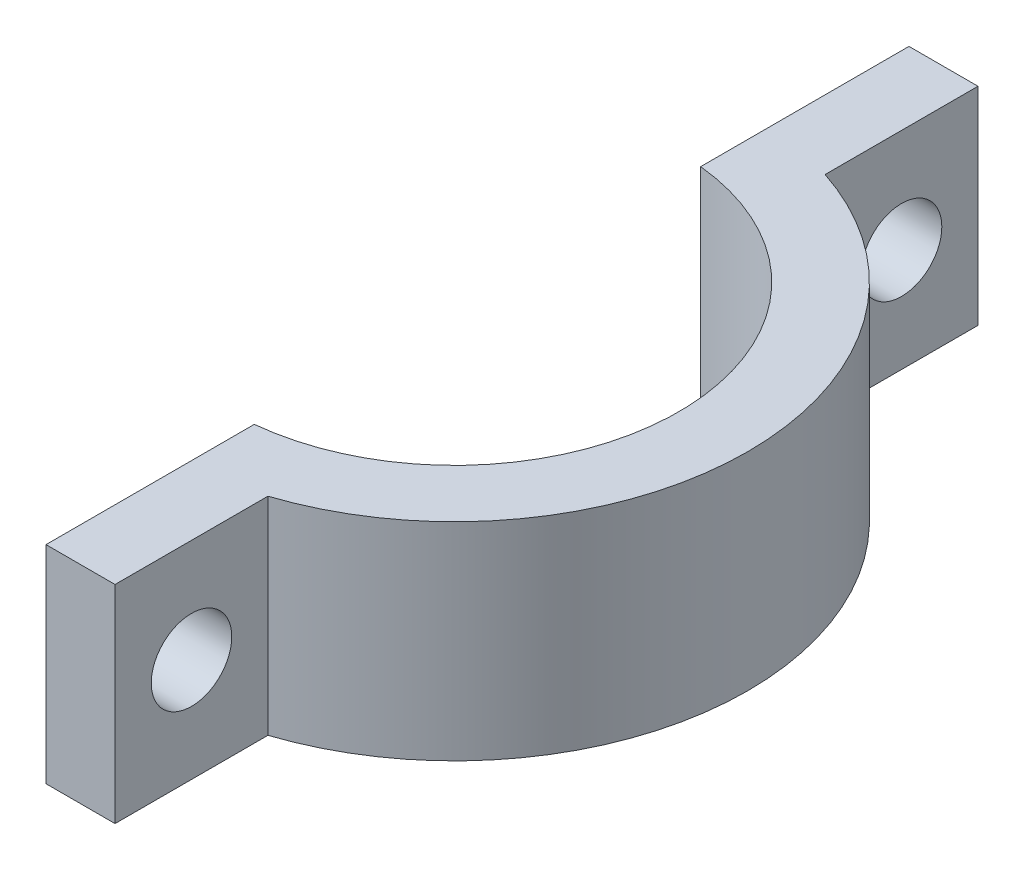
ISO-10303-21;
HEADER;
FILE_DESCRIPTION(('STEP AP214'),'2;1');
FILE_NAME('part.step','',(''),(''),'','','');
FILE_SCHEMA(('AUTOMOTIVE_DESIGN { 1 0 10303 214 1 1 1 1 }'));
ENDSEC;
DATA;
#1=APPLICATION_CONTEXT('core data for automotive mechanical design processes');
#2=APPLICATION_PROTOCOL_DEFINITION('international standard','automotive_design',2000,#1);
#3=PRODUCT_CONTEXT('',#1,'mechanical');
#4=PRODUCT('Part','Part','',(#3));
#5=PRODUCT_RELATED_PRODUCT_CATEGORY('part','',(#4));
#6=PRODUCT_DEFINITION_FORMATION('','',#4);
#7=PRODUCT_DEFINITION_CONTEXT('part definition',#1,'design');
#8=PRODUCT_DEFINITION('design','',#6,#7);
#9=PRODUCT_DEFINITION_SHAPE('','',#8);
#10=(LENGTH_UNIT() NAMED_UNIT(*) SI_UNIT(.MILLI.,.METRE.));
#11=(NAMED_UNIT(*) PLANE_ANGLE_UNIT() SI_UNIT($,.RADIAN.));
#12=(NAMED_UNIT(*) SI_UNIT($,.STERADIAN.) SOLID_ANGLE_UNIT());
#13=UNCERTAINTY_MEASURE_WITH_UNIT(LENGTH_MEASURE(1.E-05),#10,'distance_accuracy_value','');
#14=(GEOMETRIC_REPRESENTATION_CONTEXT(3) GLOBAL_UNCERTAINTY_ASSIGNED_CONTEXT((#13)) GLOBAL_UNIT_ASSIGNED_CONTEXT((#10,
#11,#12)) REPRESENTATION_CONTEXT('',''));
#15=CARTESIAN_POINT('',(0.,0.,0.));
#16=DIRECTION('',(0.,0.,1.));
#17=DIRECTION('',(1.,0.,0.));
#18=AXIS2_PLACEMENT_3D('',#15,#16,#17);
#19=CARTESIAN_POINT('',(4.,9.,-18.75));
#20=DIRECTION('',(0.,0.,1.));
#21=DIRECTION('',(1.,0.,0.));
#22=AXIS2_PLACEMENT_3D('',#19,#20,#21);
#23=PLANE('',#22);
#24=DIRECTION('',(-1.,0.,0.));
#25=VECTOR('',#24,1.);
#26=CARTESIAN_POINT('',(4.,0.,-18.75));
#27=LINE('',#26,#25);
#28=CARTESIAN_POINT('',(4.,0.,-18.75));
#29=VERTEX_POINT('',#28);
#30=CARTESIAN_POINT('',(1.,0.,-18.75));
#31=VERTEX_POINT('',#30);
#32=EDGE_CURVE('E128',#29,#31,#27,.T.);
#33=ORIENTED_EDGE('',*,*,#32,.T.);
#34=DIRECTION('',(0.,-1.,0.));
#35=VECTOR('',#34,1.);
#36=CARTESIAN_POINT('',(1.,9.,-18.75));
#37=LINE('',#36,#35);
#38=CARTESIAN_POINT('',(1.,9.,-18.75));
#39=VERTEX_POINT('',#38);
#40=EDGE_CURVE('E11',#39,#31,#37,.T.);
#41=ORIENTED_EDGE('',*,*,#40,.F.);
#42=DIRECTION('',(-1.,0.,0.));
#43=VECTOR('',#42,1.);
#44=CARTESIAN_POINT('',(4.,9.,-18.75));
#45=LINE('',#44,#43);
#46=CARTESIAN_POINT('',(4.,9.,-18.75));
#47=VERTEX_POINT('',#46);
#48=EDGE_CURVE('E143',#47,#39,#45,.T.);
#49=ORIENTED_EDGE('',*,*,#48,.F.);
#50=DIRECTION('',(0.,-1.,0.));
#51=VECTOR('',#50,1.);
#52=CARTESIAN_POINT('',(4.,9.,-18.75));
#53=LINE('',#52,#51);
#54=EDGE_CURVE('E124',#47,#29,#53,.T.);
#55=ORIENTED_EDGE('',*,*,#54,.T.);
#56=EDGE_LOOP('',(#33,#41,#49,#55));
#57=FACE_BOUND('',#56,.T.);
#58=ADVANCED_FACE('F32',(#57),#23,.F.);
#59=CARTESIAN_POINT('',(1.,9.,-18.75));
#60=DIRECTION('',(1.,0.,0.));
#61=DIRECTION('',(0.,0.,-1.));
#62=AXIS2_PLACEMENT_3D('',#59,#60,#61);
#63=PLANE('',#62);
#64=CARTESIAN_POINT('',(1.,4.5,-15.4281500064016));
#65=DIRECTION('',(1.,0.,0.));
#66=DIRECTION('',(0.,0.,-1.));
#67=AXIS2_PLACEMENT_3D('',#64,#65,#66);
#68=CIRCLE('',#67,1.75);
#69=CARTESIAN_POINT('',(1.,4.5,-17.1781500064016));
#70=VERTEX_POINT('',#69);
#71=EDGE_CURVE('E178',#70,#70,#68,.T.);
#72=ORIENTED_EDGE('',*,*,#71,.T.);
#73=EDGE_LOOP('',(#72));
#74=FACE_BOUND('',#73,.T.);
#75=DIRECTION('',(0.,0.,1.));
#76=VECTOR('',#75,1.);
#77=CARTESIAN_POINT('',(1.,0.,-18.75));
#78=LINE('',#77,#76);
#79=CARTESIAN_POINT('',(1.,0.,-9.69858237063541));
#80=VERTEX_POINT('',#79);
#81=EDGE_CURVE('E131',#31,#80,#78,.T.);
#82=ORIENTED_EDGE('',*,*,#81,.T.);
#83=DIRECTION('',(0.,-1.,0.));
#84=VECTOR('',#83,1.);
#85=CARTESIAN_POINT('',(1.,9.,-9.69858237063541));
#86=LINE('',#85,#84);
#87=CARTESIAN_POINT('',(1.,9.,-9.69858237063541));
#88=VERTEX_POINT('',#87);
#89=EDGE_CURVE('E40',#88,#80,#86,.T.);
#90=ORIENTED_EDGE('',*,*,#89,.F.);
#91=DIRECTION('',(0.,0.,1.));
#92=VECTOR('',#91,1.);
#93=CARTESIAN_POINT('',(1.,9.,-18.75));
#94=LINE('',#93,#92);
#95=EDGE_CURVE('E91',#39,#88,#94,.T.);
#96=ORIENTED_EDGE('',*,*,#95,.F.);
#97=ORIENTED_EDGE('',*,*,#40,.T.);
#98=EDGE_LOOP('',(#82,#90,#96,#97));
#99=FACE_BOUND('',#98,.T.);
#100=ADVANCED_FACE('F201',(#74,#99),#63,.F.);
#101=CARTESIAN_POINT('',(0.,9.,0.));
#102=DIRECTION('',(0.,-1.,0.));
#103=DIRECTION('',(0.,0.,-1.));
#104=AXIS2_PLACEMENT_3D('',#101,#102,#103);
#105=CYLINDRICAL_SURFACE('',#104,9.75);
#106=CARTESIAN_POINT('',(0.,0.,0.));
#107=DIRECTION('',(0.,-1.,0.));
#108=DIRECTION('',(0.,0.,1.));
#109=AXIS2_PLACEMENT_3D('',#106,#107,#108);
#110=CIRCLE('',#109,9.75);
#111=CARTESIAN_POINT('',(1.,0.,9.69858237063541));
#112=VERTEX_POINT('',#111);
#113=EDGE_CURVE('E134',#80,#112,#110,.T.);
#114=ORIENTED_EDGE('',*,*,#113,.T.);
#115=DIRECTION('',(0.,-1.,0.));
#116=VECTOR('',#115,1.);
#117=CARTESIAN_POINT('',(1.,9.,9.69858237063541));
#118=LINE('',#117,#116);
#119=CARTESIAN_POINT('',(1.,9.,9.69858237063541));
#120=VERTEX_POINT('',#119);
#121=EDGE_CURVE('E150',#120,#112,#118,.T.);
#122=ORIENTED_EDGE('',*,*,#121,.F.);
#123=CARTESIAN_POINT('',(0.,9.,0.));
#124=DIRECTION('',(0.,-1.,0.));
#125=DIRECTION('',(0.,0.,1.));
#126=AXIS2_PLACEMENT_3D('',#123,#124,#125);
#127=CIRCLE('',#126,9.75);
#128=EDGE_CURVE('E158',#88,#120,#127,.T.);
#129=ORIENTED_EDGE('',*,*,#128,.F.);
#130=ORIENTED_EDGE('',*,*,#89,.T.);
#131=EDGE_LOOP('',(#114,#122,#129,#130));
#132=FACE_BOUND('',#131,.T.);
#133=ADVANCED_FACE('F156',(#132),#105,.F.);
#134=CARTESIAN_POINT('',(1.,9.,18.75));
#135=DIRECTION('',(1.,0.,0.));
#136=DIRECTION('',(0.,0.,-1.));
#137=AXIS2_PLACEMENT_3D('',#134,#135,#136);
#138=PLANE('',#137);
#139=CARTESIAN_POINT('',(1.,4.5,15.4281500064016));
#140=DIRECTION('',(1.,0.,0.));
#141=DIRECTION('',(0.,0.,-1.));
#142=AXIS2_PLACEMENT_3D('',#139,#140,#141);
#143=CIRCLE('',#142,1.75);
#144=CARTESIAN_POINT('',(1.,4.5,13.6781500064016));
#145=VERTEX_POINT('',#144);
#146=EDGE_CURVE('E132',#145,#145,#143,.T.);
#147=ORIENTED_EDGE('',*,*,#146,.T.);
#148=EDGE_LOOP('',(#147));
#149=FACE_BOUND('',#148,.T.);
#150=DIRECTION('',(0.,0.,1.));
#151=VECTOR('',#150,1.);
#152=CARTESIAN_POINT('',(1.,0.,18.75));
#153=LINE('',#152,#151);
#154=CARTESIAN_POINT('',(1.,0.,18.75));
#155=VERTEX_POINT('',#154);
#156=EDGE_CURVE('E136',#112,#155,#153,.T.);
#157=ORIENTED_EDGE('',*,*,#156,.T.);
#158=DIRECTION('',(0.,-1.,0.));
#159=VECTOR('',#158,1.);
#160=CARTESIAN_POINT('',(1.,9.,18.75));
#161=LINE('',#160,#159);
#162=CARTESIAN_POINT('',(1.,9.,18.75));
#163=VERTEX_POINT('',#162);
#164=EDGE_CURVE('E147',#163,#155,#161,.T.);
#165=ORIENTED_EDGE('',*,*,#164,.F.);
#166=DIRECTION('',(0.,0.,1.));
#167=VECTOR('',#166,1.);
#168=CARTESIAN_POINT('',(1.,9.,18.75));
#169=LINE('',#168,#167);
#170=EDGE_CURVE('E170',#120,#163,#169,.T.);
#171=ORIENTED_EDGE('',*,*,#170,.F.);
#172=ORIENTED_EDGE('',*,*,#121,.T.);
#173=EDGE_LOOP('',(#157,#165,#171,#172));
#174=FACE_BOUND('',#173,.T.);
#175=ADVANCED_FACE('F166',(#149,#174),#138,.F.);
#176=CARTESIAN_POINT('',(4.,9.,18.75));
#177=DIRECTION('',(0.,0.,-1.));
#178=DIRECTION('',(-1.,0.,0.));
#179=AXIS2_PLACEMENT_3D('',#176,#177,#178);
#180=PLANE('',#179);
#181=DIRECTION('',(1.,0.,0.));
#182=VECTOR('',#181,1.);
#183=CARTESIAN_POINT('',(4.,0.,18.75));
#184=LINE('',#183,#182);
#185=CARTESIAN_POINT('',(4.,0.,18.75));
#186=VERTEX_POINT('',#185);
#187=EDGE_CURVE('E138',#155,#186,#184,.T.);
#188=ORIENTED_EDGE('',*,*,#187,.T.);
#189=DIRECTION('',(0.,-1.,0.));
#190=VECTOR('',#189,1.);
#191=CARTESIAN_POINT('',(4.,9.,18.75));
#192=LINE('',#191,#190);
#193=CARTESIAN_POINT('',(4.,9.,18.75));
#194=VERTEX_POINT('',#193);
#195=EDGE_CURVE('E119',#194,#186,#192,.T.);
#196=ORIENTED_EDGE('',*,*,#195,.F.);
#197=DIRECTION('',(1.,0.,0.));
#198=VECTOR('',#197,1.);
#199=CARTESIAN_POINT('',(4.,9.,18.75));
#200=LINE('',#199,#198);
#201=EDGE_CURVE('E110',#163,#194,#200,.T.);
#202=ORIENTED_EDGE('',*,*,#201,.F.);
#203=ORIENTED_EDGE('',*,*,#164,.T.);
#204=EDGE_LOOP('',(#188,#196,#202,#203));
#205=FACE_BOUND('',#204,.T.);
#206=ADVANCED_FACE('F169',(#205),#180,.F.);
#207=CARTESIAN_POINT('',(4.,9.,18.75));
#208=DIRECTION('',(-1.,0.,0.));
#209=DIRECTION('',(0.,0.,1.));
#210=AXIS2_PLACEMENT_3D('',#207,#208,#209);
#211=PLANE('',#210);
#212=CARTESIAN_POINT('',(4.,4.5,15.4281500064016));
#213=DIRECTION('',(1.,0.,0.));
#214=DIRECTION('',(0.,0.,-1.));
#215=AXIS2_PLACEMENT_3D('',#212,#213,#214);
#216=CIRCLE('',#215,1.75);
#217=CARTESIAN_POINT('',(4.,4.5,13.6781500064016));
#218=VERTEX_POINT('',#217);
#219=EDGE_CURVE('E181',#218,#218,#216,.T.);
#220=ORIENTED_EDGE('',*,*,#219,.F.);
#221=EDGE_LOOP('',(#220));
#222=FACE_BOUND('',#221,.T.);
#223=DIRECTION('',(0.,0.,-1.));
#224=VECTOR('',#223,1.);
#225=CARTESIAN_POINT('',(4.,0.,18.75));
#226=LINE('',#225,#224);
#227=CARTESIAN_POINT('',(4.,0.,12.1063000128033));
#228=VERTEX_POINT('',#227);
#229=EDGE_CURVE('E118',#186,#228,#226,.T.);
#230=ORIENTED_EDGE('',*,*,#229,.T.);
#231=DIRECTION('',(0.,-1.,0.));
#232=VECTOR('',#231,1.);
#233=CARTESIAN_POINT('',(4.,9.,12.1063000128033));
#234=LINE('',#233,#232);
#235=CARTESIAN_POINT('',(4.,9.,12.1063000128033));
#236=VERTEX_POINT('',#235);
#237=EDGE_CURVE('E115',#236,#228,#234,.T.);
#238=ORIENTED_EDGE('',*,*,#237,.F.);
#239=DIRECTION('',(0.,0.,-1.));
#240=VECTOR('',#239,1.);
#241=CARTESIAN_POINT('',(4.,9.,18.75));
#242=LINE('',#241,#240);
#243=EDGE_CURVE('E104',#194,#236,#242,.T.);
#244=ORIENTED_EDGE('',*,*,#243,.F.);
#245=ORIENTED_EDGE('',*,*,#195,.T.);
#246=EDGE_LOOP('',(#230,#238,#244,#245));
#247=FACE_BOUND('',#246,.T.);
#248=ADVANCED_FACE('F116',(#222,#247),#211,.F.);
#249=CARTESIAN_POINT('',(0.,9.,0.));
#250=DIRECTION('',(0.,-1.,0.));
#251=DIRECTION('',(0.,0.,-1.));
#252=AXIS2_PLACEMENT_3D('',#249,#250,#251);
#253=CYLINDRICAL_SURFACE('',#252,12.75);
#254=CARTESIAN_POINT('',(0.,0.,0.));
#255=DIRECTION('',(0.,1.,0.));
#256=DIRECTION('',(0.,0.,1.));
#257=AXIS2_PLACEMENT_3D('',#254,#255,#256);
#258=CIRCLE('',#257,12.75);
#259=CARTESIAN_POINT('',(4.,0.,-12.1063000128033));
#260=VERTEX_POINT('',#259);
#261=EDGE_CURVE('E77',#228,#260,#258,.T.);
#262=ORIENTED_EDGE('',*,*,#261,.T.);
#263=DIRECTION('',(0.,-1.,0.));
#264=VECTOR('',#263,1.);
#265=CARTESIAN_POINT('',(4.,9.,-12.1063000128033));
#266=LINE('',#265,#264);
#267=CARTESIAN_POINT('',(4.,9.,-12.1063000128033));
#268=VERTEX_POINT('',#267);
#269=EDGE_CURVE('E120',#268,#260,#266,.T.);
#270=ORIENTED_EDGE('',*,*,#269,.F.);
#271=CARTESIAN_POINT('',(0.,9.,0.));
#272=DIRECTION('',(0.,1.,0.));
#273=DIRECTION('',(0.,0.,1.));
#274=AXIS2_PLACEMENT_3D('',#271,#272,#273);
#275=CIRCLE('',#274,12.75);
#276=EDGE_CURVE('E108',#236,#268,#275,.T.);
#277=ORIENTED_EDGE('',*,*,#276,.F.);
#278=ORIENTED_EDGE('',*,*,#237,.T.);
#279=EDGE_LOOP('',(#262,#270,#277,#278));
#280=FACE_BOUND('',#279,.T.);
#281=ADVANCED_FACE('F122',(#280),#253,.T.);
#282=CARTESIAN_POINT('',(4.,9.,-18.75));
#283=DIRECTION('',(-1.,0.,0.));
#284=DIRECTION('',(0.,0.,1.));
#285=AXIS2_PLACEMENT_3D('',#282,#283,#284);
#286=PLANE('',#285);
#287=CARTESIAN_POINT('',(4.,4.5,-15.4281500064016));
#288=DIRECTION('',(1.,0.,0.));
#289=DIRECTION('',(0.,0.,-1.));
#290=AXIS2_PLACEMENT_3D('',#287,#288,#289);
#291=CIRCLE('',#290,1.75);
#292=CARTESIAN_POINT('',(4.,4.5,-17.1781500064016));
#293=VERTEX_POINT('',#292);
#294=EDGE_CURVE('E182',#293,#293,#291,.T.);
#295=ORIENTED_EDGE('',*,*,#294,.F.);
#296=EDGE_LOOP('',(#295));
#297=FACE_BOUND('',#296,.T.);
#298=DIRECTION('',(0.,0.,-1.));
#299=VECTOR('',#298,1.);
#300=CARTESIAN_POINT('',(4.,0.,-18.75));
#301=LINE('',#300,#299);
#302=EDGE_CURVE('E83',#260,#29,#301,.T.);
#303=ORIENTED_EDGE('',*,*,#302,.T.);
#304=ORIENTED_EDGE('',*,*,#54,.F.);
#305=DIRECTION('',(0.,0.,-1.));
#306=VECTOR('',#305,1.);
#307=CARTESIAN_POINT('',(4.,9.,-18.75));
#308=LINE('',#307,#306);
#309=EDGE_CURVE('E48',#268,#47,#308,.T.);
#310=ORIENTED_EDGE('',*,*,#309,.F.);
#311=ORIENTED_EDGE('',*,*,#269,.T.);
#312=EDGE_LOOP('',(#303,#304,#310,#311));
#313=FACE_BOUND('',#312,.T.);
#314=ADVANCED_FACE('F197',(#297,#313),#286,.F.);
#315=CARTESIAN_POINT('',(0.,9.,0.));
#316=DIRECTION('',(0.,1.,0.));
#317=DIRECTION('',(0.,0.,1.));
#318=AXIS2_PLACEMENT_3D('',#315,#316,#317);
#319=PLANE('',#318);
#320=ORIENTED_EDGE('',*,*,#48,.T.);
#321=ORIENTED_EDGE('',*,*,#95,.T.);
#322=ORIENTED_EDGE('',*,*,#128,.T.);
#323=ORIENTED_EDGE('',*,*,#170,.T.);
#324=ORIENTED_EDGE('',*,*,#201,.T.);
#325=ORIENTED_EDGE('',*,*,#243,.T.);
#326=ORIENTED_EDGE('',*,*,#276,.T.);
#327=ORIENTED_EDGE('',*,*,#309,.T.);
#328=EDGE_LOOP('',(#320,#321,#322,#323,#324,#325,#326,#327));
#329=FACE_BOUND('',#328,.T.);
#330=ADVANCED_FACE('F106',(#329),#319,.T.);
#331=CARTESIAN_POINT('',(0.,0.,0.));
#332=DIRECTION('',(0.,1.,0.));
#333=DIRECTION('',(0.,0.,1.));
#334=AXIS2_PLACEMENT_3D('',#331,#332,#333);
#335=PLANE('',#334);
#336=ORIENTED_EDGE('',*,*,#32,.F.);
#337=ORIENTED_EDGE('',*,*,#302,.F.);
#338=ORIENTED_EDGE('',*,*,#261,.F.);
#339=ORIENTED_EDGE('',*,*,#229,.F.);
#340=ORIENTED_EDGE('',*,*,#187,.F.);
#341=ORIENTED_EDGE('',*,*,#156,.F.);
#342=ORIENTED_EDGE('',*,*,#113,.F.);
#343=ORIENTED_EDGE('',*,*,#81,.F.);
#344=EDGE_LOOP('',(#336,#337,#338,#339,#340,#341,#342,#343));
#345=FACE_BOUND('',#344,.T.);
#346=ADVANCED_FACE('F162',(#345),#335,.F.);
#347=CARTESIAN_POINT('',(-6.,4.5,-15.4281500064016));
#348=DIRECTION('',(1.,0.,0.));
#349=DIRECTION('',(0.,0.,-1.));
#350=AXIS2_PLACEMENT_3D('',#347,#348,#349);
#351=CYLINDRICAL_SURFACE('',#350,1.75);
#352=ORIENTED_EDGE('',*,*,#294,.T.);
#353=EDGE_LOOP('',(#352));
#354=FACE_BOUND('',#353,.T.);
#355=ORIENTED_EDGE('',*,*,#71,.F.);
#356=EDGE_LOOP('',(#355));
#357=FACE_BOUND('',#356,.T.);
#358=ADVANCED_FACE('F219',(#354,#357),#351,.F.);
#359=CARTESIAN_POINT('',(-6.,4.5,15.4281500064016));
#360=DIRECTION('',(1.,0.,0.));
#361=DIRECTION('',(0.,0.,-1.));
#362=AXIS2_PLACEMENT_3D('',#359,#360,#361);
#363=CYLINDRICAL_SURFACE('',#362,1.75);
#364=ORIENTED_EDGE('',*,*,#219,.T.);
#365=EDGE_LOOP('',(#364));
#366=FACE_BOUND('',#365,.T.);
#367=ORIENTED_EDGE('',*,*,#146,.F.);
#368=EDGE_LOOP('',(#367));
#369=FACE_BOUND('',#368,.T.);
#370=ADVANCED_FACE('F188',(#366,#369),#363,.F.);
#371=CLOSED_SHELL('',(#58,#100,#133,#175,#206,#248,#281,#314,#330,#346,#358,#370));
#372=MANIFOLD_SOLID_BREP('B2',#371);
#373=ADVANCED_BREP_SHAPE_REPRESENTATION('',(#18,#372),#14);
#374=SHAPE_DEFINITION_REPRESENTATION(#9,#373);
ENDSEC;
END-ISO-10303-21;
